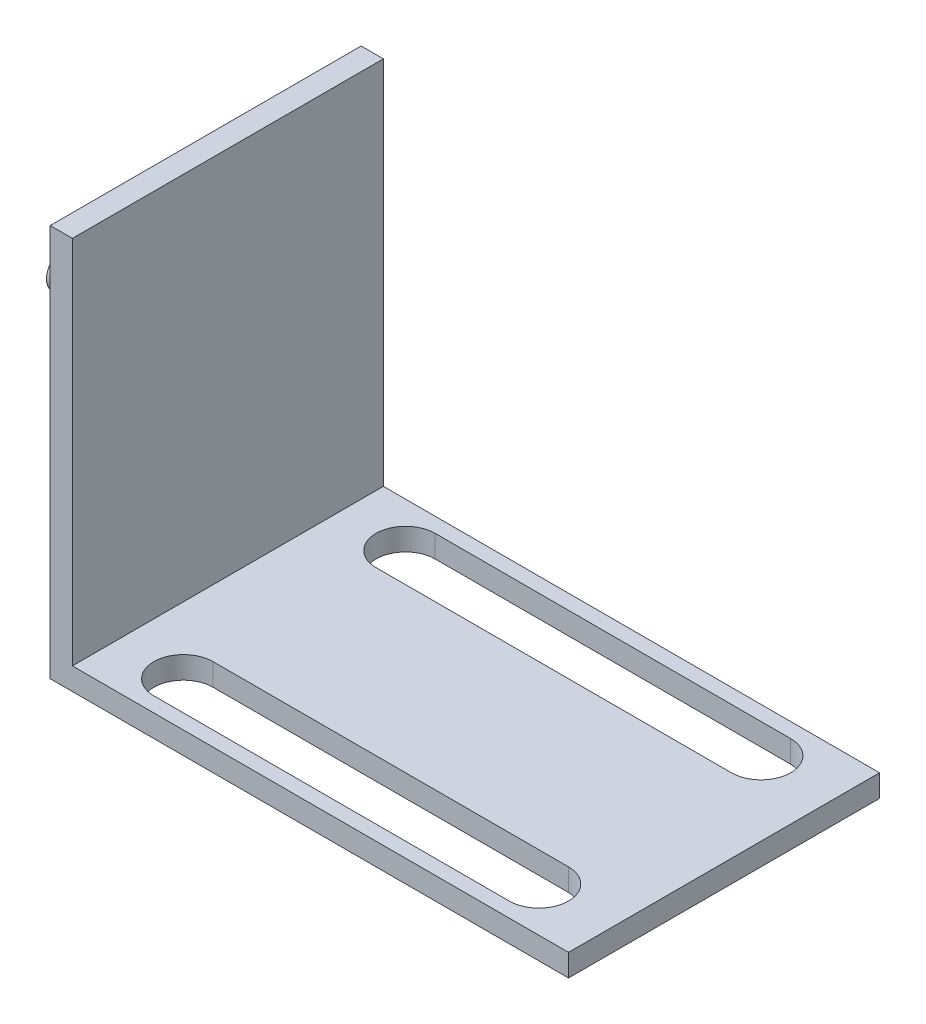
ISO-10303-21;
HEADER;
FILE_DESCRIPTION(('STEP AP214'),'2;1');
FILE_NAME('part.step','',(''),(''),'','','');
FILE_SCHEMA(('AUTOMOTIVE_DESIGN { 1 0 10303 214 1 1 1 1 }'));
ENDSEC;
DATA;
#1=APPLICATION_CONTEXT('core data for automotive mechanical design processes');
#2=APPLICATION_PROTOCOL_DEFINITION('international standard','automotive_design',2000,#1);
#3=PRODUCT_CONTEXT('',#1,'mechanical');
#4=PRODUCT('Part','Part','',(#3));
#5=PRODUCT_RELATED_PRODUCT_CATEGORY('part','',(#4));
#6=PRODUCT_DEFINITION_FORMATION('','',#4);
#7=PRODUCT_DEFINITION_CONTEXT('part definition',#1,'design');
#8=PRODUCT_DEFINITION('design','',#6,#7);
#9=PRODUCT_DEFINITION_SHAPE('','',#8);
#10=(LENGTH_UNIT() NAMED_UNIT(*) SI_UNIT(.MILLI.,.METRE.));
#11=(NAMED_UNIT(*) PLANE_ANGLE_UNIT() SI_UNIT($,.RADIAN.));
#12=(NAMED_UNIT(*) SI_UNIT($,.STERADIAN.) SOLID_ANGLE_UNIT());
#13=UNCERTAINTY_MEASURE_WITH_UNIT(LENGTH_MEASURE(1.E-05),#10,'distance_accuracy_value','');
#14=(GEOMETRIC_REPRESENTATION_CONTEXT(3) GLOBAL_UNCERTAINTY_ASSIGNED_CONTEXT((#13)) GLOBAL_UNIT_ASSIGNED_CONTEXT((#10,
#11,#12)) REPRESENTATION_CONTEXT('',''));
#15=CARTESIAN_POINT('',(0.,0.,0.));
#16=DIRECTION('',(0.,0.,1.));
#17=DIRECTION('',(1.,0.,0.));
#18=AXIS2_PLACEMENT_3D('',#15,#16,#17);
#19=CARTESIAN_POINT('',(0.,53.,-21.));
#20=DIRECTION('',(-1.,0.,0.));
#21=DIRECTION('',(0.,-1.,0.));
#22=AXIS2_PLACEMENT_3D('',#19,#20,#21);
#23=PLANE('',#22);
#24=DIRECTION('',(0.,0.,1.));
#25=VECTOR('',#24,1.);
#26=CARTESIAN_POINT('',(0.,0.,-21.));
#27=LINE('',#26,#25);
#28=CARTESIAN_POINT('',(0.,0.,-21.));
#29=VERTEX_POINT('',#28);
#30=CARTESIAN_POINT('',(0.,0.,21.));
#31=VERTEX_POINT('',#30);
#32=EDGE_CURVE('E243',#29,#31,#27,.T.);
#33=ORIENTED_EDGE('',*,*,#32,.T.);
#34=DIRECTION('',(0.,-1.,0.));
#35=VECTOR('',#34,1.);
#36=CARTESIAN_POINT('',(0.,53.,21.));
#37=LINE('',#36,#35);
#38=CARTESIAN_POINT('',(0.,53.,21.));
#39=VERTEX_POINT('',#38);
#40=EDGE_CURVE('E206',#39,#31,#37,.T.);
#41=ORIENTED_EDGE('',*,*,#40,.F.);
#42=DIRECTION('',(0.,0.,1.));
#43=VECTOR('',#42,1.);
#44=CARTESIAN_POINT('',(0.,53.,-21.));
#45=LINE('',#44,#43);
#46=CARTESIAN_POINT('',(0.,53.,-21.));
#47=VERTEX_POINT('',#46);
#48=EDGE_CURVE('E39',#47,#39,#45,.T.);
#49=ORIENTED_EDGE('',*,*,#48,.F.);
#50=DIRECTION('',(0.,-1.,0.));
#51=VECTOR('',#50,1.);
#52=CARTESIAN_POINT('',(0.,53.,-21.));
#53=LINE('',#52,#51);
#54=EDGE_CURVE('E224',#47,#29,#53,.T.);
#55=ORIENTED_EDGE('',*,*,#54,.T.);
#56=EDGE_LOOP('',(#33,#41,#49,#55));
#57=FACE_BOUND('',#56,.T.);
#58=CARTESIAN_POINT('',(0.,28.,0.));
#59=DIRECTION('',(-1.,0.,0.));
#60=DIRECTION('',(0.,-1.,0.));
#61=AXIS2_PLACEMENT_3D('',#58,#59,#60);
#62=CIRCLE('',#61,2.5);
#63=CARTESIAN_POINT('',(0.,25.5,0.));
#64=VERTEX_POINT('',#63);
#65=EDGE_CURVE('E335',#64,#64,#62,.T.);
#66=ORIENTED_EDGE('',*,*,#65,.F.);
#67=EDGE_LOOP('',(#66));
#68=FACE_BOUND('',#67,.T.);
#69=ADVANCED_FACE('F35',(#57,#68),#23,.T.);
#70=CARTESIAN_POINT('',(2.99999999999999,53.,-21.));
#71=DIRECTION('',(0.,1.,0.));
#72=DIRECTION('',(0.,0.,1.));
#73=AXIS2_PLACEMENT_3D('',#70,#71,#72);
#74=PLANE('',#73);
#75=ORIENTED_EDGE('',*,*,#48,.T.);
#76=DIRECTION('',(-1.,0.,0.));
#77=VECTOR('',#76,1.);
#78=CARTESIAN_POINT('',(2.99999999999999,53.,21.));
#79=LINE('',#78,#77);
#80=CARTESIAN_POINT('',(2.99999999999999,53.,21.));
#81=VERTEX_POINT('',#80);
#82=EDGE_CURVE('E203',#81,#39,#79,.T.);
#83=ORIENTED_EDGE('',*,*,#82,.F.);
#84=DIRECTION('',(0.,0.,1.));
#85=VECTOR('',#84,1.);
#86=CARTESIAN_POINT('',(2.99999999999999,53.,-21.));
#87=LINE('',#86,#85);
#88=CARTESIAN_POINT('',(2.99999999999999,53.,-21.));
#89=VERTEX_POINT('',#88);
#90=EDGE_CURVE('E11',#89,#81,#87,.T.);
#91=ORIENTED_EDGE('',*,*,#90,.F.);
#92=DIRECTION('',(-1.,0.,0.));
#93=VECTOR('',#92,1.);
#94=CARTESIAN_POINT('',(2.99999999999999,53.,-21.));
#95=LINE('',#94,#93);
#96=EDGE_CURVE('E221',#89,#47,#95,.T.);
#97=ORIENTED_EDGE('',*,*,#96,.T.);
#98=EDGE_LOOP('',(#75,#83,#91,#97));
#99=FACE_BOUND('',#98,.T.);
#100=ADVANCED_FACE('F37',(#99),#74,.T.);
#101=CARTESIAN_POINT('',(3.,2.99999999999999,-21.));
#102=DIRECTION('',(1.,0.,0.));
#103=DIRECTION('',(0.,1.,0.));
#104=AXIS2_PLACEMENT_3D('',#101,#102,#103);
#105=PLANE('',#104);
#106=ORIENTED_EDGE('',*,*,#90,.T.);
#107=DIRECTION('',(0.,1.,0.));
#108=VECTOR('',#107,1.);
#109=CARTESIAN_POINT('',(3.,2.99999999999999,21.));
#110=LINE('',#109,#108);
#111=CARTESIAN_POINT('',(3.,2.99999999999999,21.));
#112=VERTEX_POINT('',#111);
#113=EDGE_CURVE('E218',#112,#81,#110,.T.);
#114=ORIENTED_EDGE('',*,*,#113,.F.);
#115=DIRECTION('',(0.,0.,1.));
#116=VECTOR('',#115,1.);
#117=CARTESIAN_POINT('',(3.,2.99999999999999,-21.));
#118=LINE('',#117,#116);
#119=CARTESIAN_POINT('',(3.,2.99999999999999,-21.));
#120=VERTEX_POINT('',#119);
#121=EDGE_CURVE('E44',#120,#112,#118,.T.);
#122=ORIENTED_EDGE('',*,*,#121,.F.);
#123=DIRECTION('',(0.,1.,0.));
#124=VECTOR('',#123,1.);
#125=CARTESIAN_POINT('',(3.,2.99999999999999,-21.));
#126=LINE('',#125,#124);
#127=EDGE_CURVE('E236',#120,#89,#126,.T.);
#128=ORIENTED_EDGE('',*,*,#127,.T.);
#129=EDGE_LOOP('',(#106,#114,#122,#128));
#130=FACE_BOUND('',#129,.T.);
#131=ADVANCED_FACE('F257',(#130),#105,.T.);
#132=CARTESIAN_POINT('',(70.,3.,-21.));
#133=DIRECTION('',(0.,1.,0.));
#134=DIRECTION('',(-1.,0.,0.));
#135=AXIS2_PLACEMENT_3D('',#132,#133,#134);
#136=PLANE('',#135);
#137=CARTESIAN_POINT('',(12.,2.99999999999999,-15.));
#138=DIRECTION('',(0.,1.,0.));
#139=DIRECTION('',(1.,0.,0.));
#140=AXIS2_PLACEMENT_3D('',#137,#138,#139);
#141=CIRCLE('',#140,4.);
#142=CARTESIAN_POINT('',(12.,2.99999999999999,-19.));
#143=VERTEX_POINT('',#142);
#144=CARTESIAN_POINT('',(12.,2.99999999999999,-11.));
#145=VERTEX_POINT('',#144);
#146=EDGE_CURVE('E52',#143,#145,#141,.T.);
#147=ORIENTED_EDGE('',*,*,#146,.F.);
#148=DIRECTION('',(-1.,0.,0.));
#149=VECTOR('',#148,1.);
#150=CARTESIAN_POINT('',(12.,2.99999999999999,-19.));
#151=LINE('',#150,#149);
#152=CARTESIAN_POINT('',(60.,3.,-19.));
#153=VERTEX_POINT('',#152);
#154=EDGE_CURVE('E149',#153,#143,#151,.T.);
#155=ORIENTED_EDGE('',*,*,#154,.F.);
#156=CARTESIAN_POINT('',(60.,3.,-15.));
#157=DIRECTION('',(0.,1.,0.));
#158=DIRECTION('',(1.,0.,0.));
#159=AXIS2_PLACEMENT_3D('',#156,#157,#158);
#160=CIRCLE('',#159,4.);
#161=CARTESIAN_POINT('',(60.,3.,-11.));
#162=VERTEX_POINT('',#161);
#163=EDGE_CURVE('E163',#162,#153,#160,.T.);
#164=ORIENTED_EDGE('',*,*,#163,.F.);
#165=DIRECTION('',(1.,0.,0.));
#166=VECTOR('',#165,1.);
#167=CARTESIAN_POINT('',(12.,2.99999999999999,-11.));
#168=LINE('',#167,#166);
#169=EDGE_CURVE('E156',#145,#162,#168,.T.);
#170=ORIENTED_EDGE('',*,*,#169,.F.);
#171=EDGE_LOOP('',(#147,#155,#164,#170));
#172=FACE_BOUND('',#171,.T.);
#173=CARTESIAN_POINT('',(12.,2.99999999999999,15.));
#174=DIRECTION('',(0.,1.,0.));
#175=DIRECTION('',(-1.,0.,0.));
#176=AXIS2_PLACEMENT_3D('',#173,#174,#175);
#177=CIRCLE('',#176,4.);
#178=CARTESIAN_POINT('',(12.,2.99999999999999,11.));
#179=VERTEX_POINT('',#178);
#180=CARTESIAN_POINT('',(12.,2.99999999999999,19.));
#181=VERTEX_POINT('',#180);
#182=EDGE_CURVE('E180',#179,#181,#177,.T.);
#183=ORIENTED_EDGE('',*,*,#182,.F.);
#184=DIRECTION('',(-1.,0.,0.));
#185=VECTOR('',#184,1.);
#186=CARTESIAN_POINT('',(12.,2.99999999999999,11.));
#187=LINE('',#186,#185);
#188=CARTESIAN_POINT('',(60.,3.,11.));
#189=VERTEX_POINT('',#188);
#190=EDGE_CURVE('E188',#189,#179,#187,.T.);
#191=ORIENTED_EDGE('',*,*,#190,.F.);
#192=CARTESIAN_POINT('',(60.,3.,15.));
#193=DIRECTION('',(0.,1.,0.));
#194=DIRECTION('',(-1.,0.,0.));
#195=AXIS2_PLACEMENT_3D('',#192,#193,#194);
#196=CIRCLE('',#195,4.);
#197=CARTESIAN_POINT('',(60.,3.,19.));
#198=VERTEX_POINT('',#197);
#199=EDGE_CURVE('E185',#198,#189,#196,.T.);
#200=ORIENTED_EDGE('',*,*,#199,.F.);
#201=DIRECTION('',(1.,0.,0.));
#202=VECTOR('',#201,1.);
#203=CARTESIAN_POINT('',(12.,2.99999999999999,19.));
#204=LINE('',#203,#202);
#205=EDGE_CURVE('E182',#181,#198,#204,.T.);
#206=ORIENTED_EDGE('',*,*,#205,.F.);
#207=EDGE_LOOP('',(#183,#191,#200,#206));
#208=FACE_BOUND('',#207,.T.);
#209=ORIENTED_EDGE('',*,*,#121,.T.);
#210=DIRECTION('',(-1.,0.,0.));
#211=VECTOR('',#210,1.);
#212=CARTESIAN_POINT('',(70.,3.,21.));
#213=LINE('',#212,#211);
#214=CARTESIAN_POINT('',(70.,3.,21.));
#215=VERTEX_POINT('',#214);
#216=EDGE_CURVE('E215',#215,#112,#213,.T.);
#217=ORIENTED_EDGE('',*,*,#216,.F.);
#218=DIRECTION('',(0.,0.,1.));
#219=VECTOR('',#218,1.);
#220=CARTESIAN_POINT('',(70.,3.,-21.));
#221=LINE('',#220,#219);
#222=CARTESIAN_POINT('',(70.,3.,-21.));
#223=VERTEX_POINT('',#222);
#224=EDGE_CURVE('E240',#223,#215,#221,.T.);
#225=ORIENTED_EDGE('',*,*,#224,.F.);
#226=DIRECTION('',(-1.,0.,0.));
#227=VECTOR('',#226,1.);
#228=CARTESIAN_POINT('',(70.,3.,-21.));
#229=LINE('',#228,#227);
#230=EDGE_CURVE('E233',#223,#120,#229,.T.);
#231=ORIENTED_EDGE('',*,*,#230,.T.);
#232=EDGE_LOOP('',(#209,#217,#225,#231));
#233=FACE_BOUND('',#232,.T.);
#234=ADVANCED_FACE('F269',(#172,#208,#233),#136,.T.);
#235=CARTESIAN_POINT('',(70.,0.,-21.));
#236=DIRECTION('',(1.,0.,0.));
#237=DIRECTION('',(0.,0.,-1.));
#238=AXIS2_PLACEMENT_3D('',#235,#236,#237);
#239=PLANE('',#238);
#240=ORIENTED_EDGE('',*,*,#224,.T.);
#241=DIRECTION('',(0.,1.,0.));
#242=VECTOR('',#241,1.);
#243=CARTESIAN_POINT('',(70.,0.,21.));
#244=LINE('',#243,#242);
#245=CARTESIAN_POINT('',(70.,0.,21.));
#246=VERTEX_POINT('',#245);
#247=EDGE_CURVE('E212',#246,#215,#244,.T.);
#248=ORIENTED_EDGE('',*,*,#247,.F.);
#249=DIRECTION('',(0.,0.,1.));
#250=VECTOR('',#249,1.);
#251=CARTESIAN_POINT('',(70.,0.,-21.));
#252=LINE('',#251,#250);
#253=CARTESIAN_POINT('',(70.,0.,-21.));
#254=VERTEX_POINT('',#253);
#255=EDGE_CURVE('E242',#254,#246,#252,.T.);
#256=ORIENTED_EDGE('',*,*,#255,.F.);
#257=DIRECTION('',(0.,1.,0.));
#258=VECTOR('',#257,1.);
#259=CARTESIAN_POINT('',(70.,0.,-21.));
#260=LINE('',#259,#258);
#261=EDGE_CURVE('E230',#254,#223,#260,.T.);
#262=ORIENTED_EDGE('',*,*,#261,.T.);
#263=EDGE_LOOP('',(#240,#248,#256,#262));
#264=FACE_BOUND('',#263,.T.);
#265=ADVANCED_FACE('F267',(#264),#239,.T.);
#266=CARTESIAN_POINT('',(0.,0.,-21.));
#267=DIRECTION('',(0.,-1.,0.));
#268=DIRECTION('',(0.,0.,-1.));
#269=AXIS2_PLACEMENT_3D('',#266,#267,#268);
#270=PLANE('',#269);
#271=CARTESIAN_POINT('',(12.,0.,-15.));
#272=DIRECTION('',(0.,-1.,0.));
#273=DIRECTION('',(0.,0.,-1.));
#274=AXIS2_PLACEMENT_3D('',#271,#272,#273);
#275=CIRCLE('',#274,4.);
#276=CARTESIAN_POINT('',(12.,0.,-19.));
#277=VERTEX_POINT('',#276);
#278=CARTESIAN_POINT('',(12.,0.,-11.));
#279=VERTEX_POINT('',#278);
#280=EDGE_CURVE('E147',#277,#279,#275,.F.);
#281=ORIENTED_EDGE('',*,*,#280,.T.);
#282=DIRECTION('',(1.,0.,0.));
#283=VECTOR('',#282,1.);
#284=CARTESIAN_POINT('',(12.,0.,-11.));
#285=LINE('',#284,#283);
#286=CARTESIAN_POINT('',(60.,0.,-11.));
#287=VERTEX_POINT('',#286);
#288=EDGE_CURVE('E136',#279,#287,#285,.T.);
#289=ORIENTED_EDGE('',*,*,#288,.T.);
#290=CARTESIAN_POINT('',(60.,0.,-15.));
#291=DIRECTION('',(0.,-1.,0.));
#292=DIRECTION('',(0.,0.,-1.));
#293=AXIS2_PLACEMENT_3D('',#290,#291,#292);
#294=CIRCLE('',#293,4.);
#295=CARTESIAN_POINT('',(60.,0.,-19.));
#296=VERTEX_POINT('',#295);
#297=EDGE_CURVE('E158',#287,#296,#294,.F.);
#298=ORIENTED_EDGE('',*,*,#297,.T.);
#299=DIRECTION('',(-1.,0.,0.));
#300=VECTOR('',#299,1.);
#301=CARTESIAN_POINT('',(12.,0.,-19.));
#302=LINE('',#301,#300);
#303=EDGE_CURVE('E154',#296,#277,#302,.T.);
#304=ORIENTED_EDGE('',*,*,#303,.T.);
#305=EDGE_LOOP('',(#281,#289,#298,#304));
#306=FACE_BOUND('',#305,.T.);
#307=CARTESIAN_POINT('',(12.,0.,15.));
#308=DIRECTION('',(0.,-1.,0.));
#309=DIRECTION('',(0.,0.,-1.));
#310=AXIS2_PLACEMENT_3D('',#307,#308,#309);
#311=CIRCLE('',#310,4.);
#312=CARTESIAN_POINT('',(12.,0.,11.));
#313=VERTEX_POINT('',#312);
#314=CARTESIAN_POINT('',(12.,0.,19.));
#315=VERTEX_POINT('',#314);
#316=EDGE_CURVE('E177',#313,#315,#311,.F.);
#317=ORIENTED_EDGE('',*,*,#316,.T.);
#318=DIRECTION('',(1.,0.,0.));
#319=VECTOR('',#318,1.);
#320=CARTESIAN_POINT('',(12.,0.,19.));
#321=LINE('',#320,#319);
#322=CARTESIAN_POINT('',(60.,0.,19.));
#323=VERTEX_POINT('',#322);
#324=EDGE_CURVE('E194',#315,#323,#321,.T.);
#325=ORIENTED_EDGE('',*,*,#324,.T.);
#326=CARTESIAN_POINT('',(60.,0.,15.));
#327=DIRECTION('',(0.,-1.,0.));
#328=DIRECTION('',(0.,0.,-1.));
#329=AXIS2_PLACEMENT_3D('',#326,#327,#328);
#330=CIRCLE('',#329,4.);
#331=CARTESIAN_POINT('',(60.,0.,11.));
#332=VERTEX_POINT('',#331);
#333=EDGE_CURVE('E143',#323,#332,#330,.F.);
#334=ORIENTED_EDGE('',*,*,#333,.T.);
#335=DIRECTION('',(-1.,0.,0.));
#336=VECTOR('',#335,1.);
#337=CARTESIAN_POINT('',(12.,0.,11.));
#338=LINE('',#337,#336);
#339=EDGE_CURVE('E174',#332,#313,#338,.T.);
#340=ORIENTED_EDGE('',*,*,#339,.T.);
#341=EDGE_LOOP('',(#317,#325,#334,#340));
#342=FACE_BOUND('',#341,.T.);
#343=ORIENTED_EDGE('',*,*,#255,.T.);
#344=DIRECTION('',(1.,0.,0.));
#345=VECTOR('',#344,1.);
#346=CARTESIAN_POINT('',(0.,0.,21.));
#347=LINE('',#346,#345);
#348=EDGE_CURVE('E209',#31,#246,#347,.T.);
#349=ORIENTED_EDGE('',*,*,#348,.F.);
#350=ORIENTED_EDGE('',*,*,#32,.F.);
#351=DIRECTION('',(1.,0.,0.));
#352=VECTOR('',#351,1.);
#353=CARTESIAN_POINT('',(0.,0.,-21.));
#354=LINE('',#353,#352);
#355=EDGE_CURVE('E227',#29,#254,#354,.T.);
#356=ORIENTED_EDGE('',*,*,#355,.T.);
#357=EDGE_LOOP('',(#343,#349,#350,#356));
#358=FACE_BOUND('',#357,.T.);
#359=ADVANCED_FACE('F152',(#306,#342,#358),#270,.T.);
#360=CARTESIAN_POINT('',(0.,0.,-21.));
#361=DIRECTION('',(0.,0.,1.));
#362=DIRECTION('',(1.,0.,0.));
#363=AXIS2_PLACEMENT_3D('',#360,#361,#362);
#364=PLANE('',#363);
#365=ORIENTED_EDGE('',*,*,#96,.F.);
#366=ORIENTED_EDGE('',*,*,#127,.F.);
#367=ORIENTED_EDGE('',*,*,#230,.F.);
#368=ORIENTED_EDGE('',*,*,#261,.F.);
#369=ORIENTED_EDGE('',*,*,#355,.F.);
#370=ORIENTED_EDGE('',*,*,#54,.F.);
#371=EDGE_LOOP('',(#365,#366,#367,#368,#369,#370));
#372=FACE_BOUND('',#371,.T.);
#373=ADVANCED_FACE('F260',(#372),#364,.F.);
#374=CARTESIAN_POINT('',(0.,0.,21.));
#375=DIRECTION('',(0.,0.,1.));
#376=DIRECTION('',(1.,0.,0.));
#377=AXIS2_PLACEMENT_3D('',#374,#375,#376);
#378=PLANE('',#377);
#379=ORIENTED_EDGE('',*,*,#82,.T.);
#380=ORIENTED_EDGE('',*,*,#40,.T.);
#381=ORIENTED_EDGE('',*,*,#348,.T.);
#382=ORIENTED_EDGE('',*,*,#247,.T.);
#383=ORIENTED_EDGE('',*,*,#216,.T.);
#384=ORIENTED_EDGE('',*,*,#113,.T.);
#385=EDGE_LOOP('',(#379,#380,#381,#382,#383,#384));
#386=FACE_BOUND('',#385,.T.);
#387=ADVANCED_FACE('F253',(#386),#378,.T.);
#388=CARTESIAN_POINT('',(12.,-0.00100000000001184,15.));
#389=DIRECTION('',(0.,1.,0.));
#390=DIRECTION('',(-1.,0.,0.));
#391=AXIS2_PLACEMENT_3D('',#388,#389,#390);
#392=CYLINDRICAL_SURFACE('',#391,4.);
#393=DIRECTION('',(0.,1.,0.));
#394=VECTOR('',#393,1.);
#395=CARTESIAN_POINT('',(12.,-0.00100000000001184,11.));
#396=LINE('',#395,#394);
#397=EDGE_CURVE('E192',#313,#179,#396,.T.);
#398=ORIENTED_EDGE('',*,*,#397,.T.);
#399=ORIENTED_EDGE('',*,*,#182,.T.);
#400=DIRECTION('',(0.,1.,0.));
#401=VECTOR('',#400,1.);
#402=CARTESIAN_POINT('',(12.,-0.00100000000001184,19.));
#403=LINE('',#402,#401);
#404=EDGE_CURVE('E191',#315,#181,#403,.T.);
#405=ORIENTED_EDGE('',*,*,#404,.F.);
#406=ORIENTED_EDGE('',*,*,#316,.F.);
#407=EDGE_LOOP('',(#398,#399,#405,#406));
#408=FACE_BOUND('',#407,.T.);
#409=ADVANCED_FACE('F293',(#408),#392,.F.);
#410=CARTESIAN_POINT('',(12.,-0.00100000000001184,11.));
#411=DIRECTION('',(0.,0.,-1.));
#412=DIRECTION('',(-1.,0.,0.));
#413=AXIS2_PLACEMENT_3D('',#410,#411,#412);
#414=PLANE('',#413);
#415=DIRECTION('',(0.,1.,0.));
#416=VECTOR('',#415,1.);
#417=CARTESIAN_POINT('',(60.,-0.0010000000000023,11.));
#418=LINE('',#417,#416);
#419=EDGE_CURVE('E195',#332,#189,#418,.T.);
#420=ORIENTED_EDGE('',*,*,#419,.T.);
#421=ORIENTED_EDGE('',*,*,#190,.T.);
#422=ORIENTED_EDGE('',*,*,#397,.F.);
#423=ORIENTED_EDGE('',*,*,#339,.F.);
#424=EDGE_LOOP('',(#420,#421,#422,#423));
#425=FACE_BOUND('',#424,.T.);
#426=ADVANCED_FACE('F298',(#425),#414,.F.);
#427=CARTESIAN_POINT('',(60.,-0.0010000000000023,15.));
#428=DIRECTION('',(0.,1.,0.));
#429=DIRECTION('',(-1.,0.,0.));
#430=AXIS2_PLACEMENT_3D('',#427,#428,#429);
#431=CYLINDRICAL_SURFACE('',#430,4.);
#432=DIRECTION('',(0.,1.,0.));
#433=VECTOR('',#432,1.);
#434=CARTESIAN_POINT('',(60.,-0.0010000000000023,19.));
#435=LINE('',#434,#433);
#436=EDGE_CURVE('E197',#323,#198,#435,.T.);
#437=ORIENTED_EDGE('',*,*,#436,.T.);
#438=ORIENTED_EDGE('',*,*,#199,.T.);
#439=ORIENTED_EDGE('',*,*,#419,.F.);
#440=ORIENTED_EDGE('',*,*,#333,.F.);
#441=EDGE_LOOP('',(#437,#438,#439,#440));
#442=FACE_BOUND('',#441,.T.);
#443=ADVANCED_FACE('F303',(#442),#431,.F.);
#444=CARTESIAN_POINT('',(12.,-0.00100000000001184,19.));
#445=DIRECTION('',(0.,0.,1.));
#446=DIRECTION('',(1.,0.,0.));
#447=AXIS2_PLACEMENT_3D('',#444,#445,#446);
#448=PLANE('',#447);
#449=ORIENTED_EDGE('',*,*,#404,.T.);
#450=ORIENTED_EDGE('',*,*,#205,.T.);
#451=ORIENTED_EDGE('',*,*,#436,.F.);
#452=ORIENTED_EDGE('',*,*,#324,.F.);
#453=EDGE_LOOP('',(#449,#450,#451,#452));
#454=FACE_BOUND('',#453,.T.);
#455=ADVANCED_FACE('F300',(#454),#448,.F.);
#456=CARTESIAN_POINT('',(12.,-0.00100000000001184,-15.));
#457=DIRECTION('',(0.,1.,0.));
#458=DIRECTION('',(-1.,0.,0.));
#459=AXIS2_PLACEMENT_3D('',#456,#457,#458);
#460=CYLINDRICAL_SURFACE('',#459,4.);
#461=DIRECTION('',(0.,1.,0.));
#462=VECTOR('',#461,1.);
#463=CARTESIAN_POINT('',(12.,-0.00100000000001184,-19.));
#464=LINE('',#463,#462);
#465=EDGE_CURVE('E144',#277,#143,#464,.T.);
#466=ORIENTED_EDGE('',*,*,#465,.T.);
#467=ORIENTED_EDGE('',*,*,#146,.T.);
#468=DIRECTION('',(0.,1.,0.));
#469=VECTOR('',#468,1.);
#470=CARTESIAN_POINT('',(12.,-0.00100000000001184,-11.));
#471=LINE('',#470,#469);
#472=EDGE_CURVE('E138',#279,#145,#471,.T.);
#473=ORIENTED_EDGE('',*,*,#472,.F.);
#474=ORIENTED_EDGE('',*,*,#280,.F.);
#475=EDGE_LOOP('',(#466,#467,#473,#474));
#476=FACE_BOUND('',#475,.T.);
#477=ADVANCED_FACE('F146',(#476),#460,.F.);
#478=CARTESIAN_POINT('',(12.,-0.00100000000001184,-19.));
#479=DIRECTION('',(0.,0.,-1.));
#480=DIRECTION('',(-1.,0.,0.));
#481=AXIS2_PLACEMENT_3D('',#478,#479,#480);
#482=PLANE('',#481);
#483=DIRECTION('',(0.,1.,0.));
#484=VECTOR('',#483,1.);
#485=CARTESIAN_POINT('',(60.,-0.0010000000000023,-19.));
#486=LINE('',#485,#484);
#487=EDGE_CURVE('E169',#296,#153,#486,.T.);
#488=ORIENTED_EDGE('',*,*,#487,.T.);
#489=ORIENTED_EDGE('',*,*,#154,.T.);
#490=ORIENTED_EDGE('',*,*,#465,.F.);
#491=ORIENTED_EDGE('',*,*,#303,.F.);
#492=EDGE_LOOP('',(#488,#489,#490,#491));
#493=FACE_BOUND('',#492,.T.);
#494=ADVANCED_FACE('F313',(#493),#482,.F.);
#495=CARTESIAN_POINT('',(60.,-0.0010000000000023,-15.));
#496=DIRECTION('',(0.,1.,0.));
#497=DIRECTION('',(-1.,0.,0.));
#498=AXIS2_PLACEMENT_3D('',#495,#496,#497);
#499=CYLINDRICAL_SURFACE('',#498,4.);
#500=DIRECTION('',(0.,1.,0.));
#501=VECTOR('',#500,1.);
#502=CARTESIAN_POINT('',(60.,-0.0010000000000023,-11.));
#503=LINE('',#502,#501);
#504=EDGE_CURVE('E60',#287,#162,#503,.T.);
#505=ORIENTED_EDGE('',*,*,#504,.T.);
#506=ORIENTED_EDGE('',*,*,#163,.T.);
#507=ORIENTED_EDGE('',*,*,#487,.F.);
#508=ORIENTED_EDGE('',*,*,#297,.F.);
#509=EDGE_LOOP('',(#505,#506,#507,#508));
#510=FACE_BOUND('',#509,.T.);
#511=ADVANCED_FACE('F317',(#510),#499,.F.);
#512=CARTESIAN_POINT('',(12.,-0.00100000000001184,-11.));
#513=DIRECTION('',(0.,0.,1.));
#514=DIRECTION('',(1.,0.,0.));
#515=AXIS2_PLACEMENT_3D('',#512,#513,#514);
#516=PLANE('',#515);
#517=ORIENTED_EDGE('',*,*,#472,.T.);
#518=ORIENTED_EDGE('',*,*,#169,.T.);
#519=ORIENTED_EDGE('',*,*,#504,.F.);
#520=ORIENTED_EDGE('',*,*,#288,.F.);
#521=EDGE_LOOP('',(#517,#518,#519,#520));
#522=FACE_BOUND('',#521,.T.);
#523=ADVANCED_FACE('F137',(#522),#516,.F.);
#524=CARTESIAN_POINT('',(-19.,28.,0.));
#525=DIRECTION('',(1.,0.,0.));
#526=DIRECTION('',(0.,1.,0.));
#527=AXIS2_PLACEMENT_3D('',#524,#525,#526);
#528=CYLINDRICAL_SURFACE('',#527,2.5);
#529=CARTESIAN_POINT('',(-19.,28.,0.));
#530=DIRECTION('',(-1.,0.,0.));
#531=DIRECTION('',(0.,-1.,0.));
#532=AXIS2_PLACEMENT_3D('',#529,#530,#531);
#533=CIRCLE('',#532,2.5);
#534=CARTESIAN_POINT('',(-19.,25.5,0.));
#535=VERTEX_POINT('',#534);
#536=EDGE_CURVE('E334',#535,#535,#533,.T.);
#537=ORIENTED_EDGE('',*,*,#536,.F.);
#538=EDGE_LOOP('',(#537));
#539=FACE_BOUND('',#538,.T.);
#540=ORIENTED_EDGE('',*,*,#65,.T.);
#541=EDGE_LOOP('',(#540));
#542=FACE_BOUND('',#541,.T.);
#543=ADVANCED_FACE('F316',(#539,#542),#528,.T.);
#544=CARTESIAN_POINT('',(-19.,28.,0.));
#545=DIRECTION('',(-1.,0.,0.));
#546=DIRECTION('',(0.,-1.,0.));
#547=AXIS2_PLACEMENT_3D('',#544,#545,#546);
#548=PLANE('',#547);
#549=ORIENTED_EDGE('',*,*,#536,.T.);
#550=EDGE_LOOP('',(#549));
#551=FACE_BOUND('',#550,.T.);
#552=ADVANCED_FACE('F326',(#551),#548,.T.);
#553=CLOSED_SHELL('',(#69,#100,#131,#234,#265,#359,#373,#387,#409,#426,#443,#455,#477,#494,#511,
#523,#543,#552));
#554=MANIFOLD_SOLID_BREP('B2',#553);
#555=ADVANCED_BREP_SHAPE_REPRESENTATION('',(#18,#554),#14);
#556=SHAPE_DEFINITION_REPRESENTATION(#9,#555);
ENDSEC;
END-ISO-10303-21;
